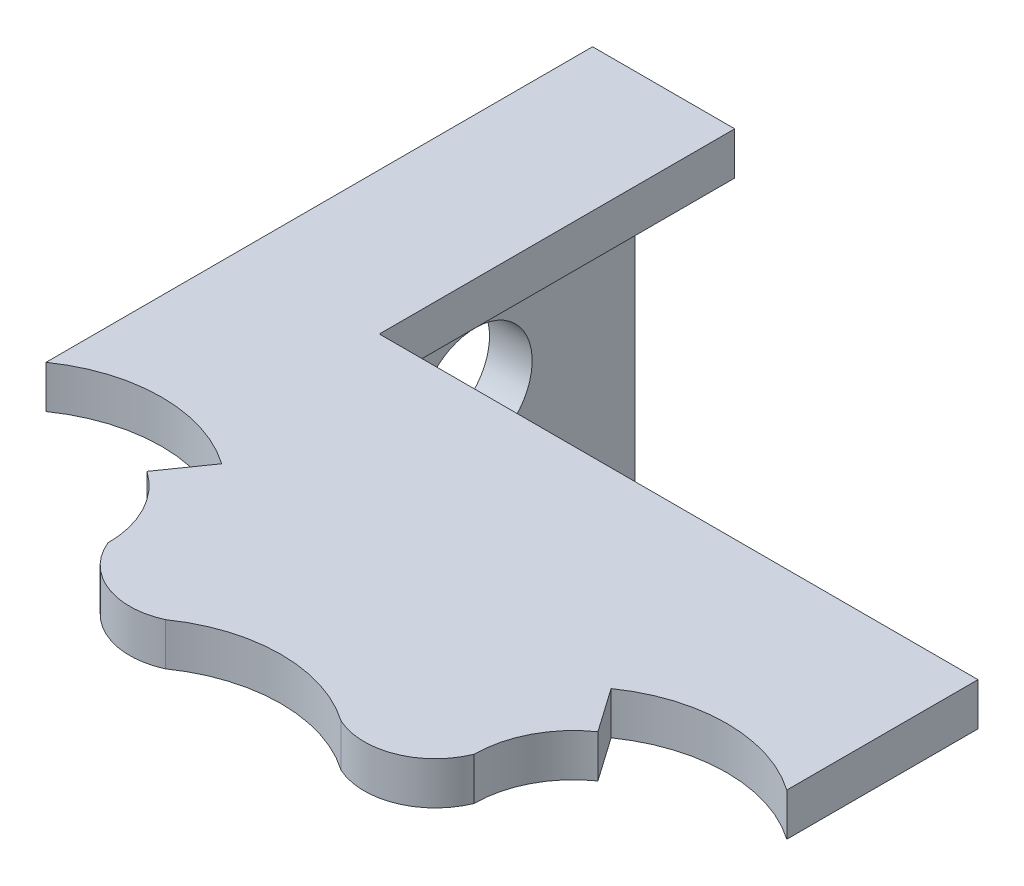
ISO-10303-21;
HEADER;
FILE_DESCRIPTION(('STEP AP214'),'2;1');
FILE_NAME('part.step','',(''),(''),'','','');
FILE_SCHEMA(('AUTOMOTIVE_DESIGN { 1 0 10303 214 1 1 1 1 }'));
ENDSEC;
DATA;
#1=APPLICATION_CONTEXT('core data for automotive mechanical design processes');
#2=APPLICATION_PROTOCOL_DEFINITION('international standard','automotive_design',2000,#1);
#3=PRODUCT_CONTEXT('',#1,'mechanical');
#4=PRODUCT('Part','Part','',(#3));
#5=PRODUCT_RELATED_PRODUCT_CATEGORY('part','',(#4));
#6=PRODUCT_DEFINITION_FORMATION('','',#4);
#7=PRODUCT_DEFINITION_CONTEXT('part definition',#1,'design');
#8=PRODUCT_DEFINITION('design','',#6,#7);
#9=PRODUCT_DEFINITION_SHAPE('','',#8);
#10=(LENGTH_UNIT() NAMED_UNIT(*) SI_UNIT(.MILLI.,.METRE.));
#11=(NAMED_UNIT(*) PLANE_ANGLE_UNIT() SI_UNIT($,.RADIAN.));
#12=(NAMED_UNIT(*) SI_UNIT($,.STERADIAN.) SOLID_ANGLE_UNIT());
#13=UNCERTAINTY_MEASURE_WITH_UNIT(LENGTH_MEASURE(1.E-05),#10,'distance_accuracy_value','');
#14=(GEOMETRIC_REPRESENTATION_CONTEXT(3) GLOBAL_UNCERTAINTY_ASSIGNED_CONTEXT((#13)) GLOBAL_UNIT_ASSIGNED_CONTEXT((#10,
#11,#12)) REPRESENTATION_CONTEXT('',''));
#15=CARTESIAN_POINT('',(0.,0.,0.));
#16=DIRECTION('',(0.,0.,1.));
#17=DIRECTION('',(1.,0.,0.));
#18=AXIS2_PLACEMENT_3D('',#15,#16,#17);
#19=CARTESIAN_POINT('',(-19.8752830168529,3.,-11.4749999999999));
#20=DIRECTION('',(0.,-1.,0.));
#21=DIRECTION('',(0.,0.,-1.));
#22=AXIS2_PLACEMENT_3D('',#19,#20,#21);
#23=CYLINDRICAL_SURFACE('',#22,10.775);
#24=CARTESIAN_POINT('',(-19.8752830168529,0.,-11.4749999999999));
#25=DIRECTION('',(0.,-1.,0.));
#26=DIRECTION('',(0.,0.,-1.));
#27=AXIS2_PLACEMENT_3D('',#24,#25,#26);
#28=CIRCLE('',#27,10.775);
#29=CARTESIAN_POINT('',(-26.0555691185354,0.,-20.3013632772138));
#30=VERTEX_POINT('',#29);
#31=CARTESIAN_POINT('',(-13.6949969151704,0.,-20.3013632772138));
#32=VERTEX_POINT('',#31);
#33=EDGE_CURVE('E181',#30,#32,#28,.T.);
#34=ORIENTED_EDGE('',*,*,#33,.T.);
#35=DIRECTION('',(0.,-1.,0.));
#36=VECTOR('',#35,1.);
#37=CARTESIAN_POINT('',(-13.6949969151704,3.,-20.3013632772138));
#38=LINE('',#37,#36);
#39=CARTESIAN_POINT('',(-13.6949969151704,3.,-20.3013632772138));
#40=VERTEX_POINT('',#39);
#41=EDGE_CURVE('E11',#40,#32,#38,.T.);
#42=ORIENTED_EDGE('',*,*,#41,.F.);
#43=CARTESIAN_POINT('',(-19.8752830168529,3.,-11.4749999999999));
#44=DIRECTION('',(0.,-1.,0.));
#45=DIRECTION('',(0.,0.,-1.));
#46=AXIS2_PLACEMENT_3D('',#43,#44,#45);
#47=CIRCLE('',#46,10.775);
#48=CARTESIAN_POINT('',(-26.0555691185354,3.,-20.3013632772138));
#49=VERTEX_POINT('',#48);
#50=EDGE_CURVE('E190',#49,#40,#47,.T.);
#51=ORIENTED_EDGE('',*,*,#50,.F.);
#52=DIRECTION('',(0.,-1.,0.));
#53=VECTOR('',#52,1.);
#54=CARTESIAN_POINT('',(-26.0555691185354,3.,-20.3013632772138));
#55=LINE('',#54,#53);
#56=EDGE_CURVE('E218',#49,#30,#55,.T.);
#57=ORIENTED_EDGE('',*,*,#56,.T.);
#58=EDGE_LOOP('',(#34,#42,#51,#57));
#59=FACE_BOUND('',#58,.T.);
#60=ADVANCED_FACE('F39',(#59),#23,.F.);
#61=CARTESIAN_POINT('',(-15.8602479623956,3.,-17.2090643100228));
#62=DIRECTION('',(0.819152044288993,0.,0.573576436351044));
#63=DIRECTION('',(0.573576436351044,0.,-0.819152044288993));
#64=AXIS2_PLACEMENT_3D('',#61,#62,#63);
#65=PLANE('',#64);
#66=DIRECTION('',(-0.573576436351044,0.,0.819152044288993));
#67=VECTOR('',#66,1.);
#68=CARTESIAN_POINT('',(-15.8602479623956,0.,-17.2090643100228));
#69=LINE('',#68,#67);
#70=CARTESIAN_POINT('',(-15.8602479623956,0.,-17.2090643100228));
#71=VERTEX_POINT('',#70);
#72=EDGE_CURVE('E184',#32,#71,#69,.T.);
#73=ORIENTED_EDGE('',*,*,#72,.T.);
#74=DIRECTION('',(0.,-1.,0.));
#75=VECTOR('',#74,1.);
#76=CARTESIAN_POINT('',(-15.8602479623956,3.,-17.2090643100228));
#77=LINE('',#76,#75);
#78=CARTESIAN_POINT('',(-15.8602479623956,3.,-17.2090643100228));
#79=VERTEX_POINT('',#78);
#80=EDGE_CURVE('E46',#79,#71,#77,.T.);
#81=ORIENTED_EDGE('',*,*,#80,.F.);
#82=DIRECTION('',(-0.573576436351044,0.,0.819152044288993));
#83=VECTOR('',#82,1.);
#84=CARTESIAN_POINT('',(-15.8602479623956,3.,-17.2090643100228));
#85=LINE('',#84,#83);
#86=EDGE_CURVE('E193',#40,#79,#85,.T.);
#87=ORIENTED_EDGE('',*,*,#86,.F.);
#88=ORIENTED_EDGE('',*,*,#41,.T.);
#89=EDGE_LOOP('',(#73,#81,#87,#88));
#90=FACE_BOUND('',#89,.T.);
#91=ADVANCED_FACE('F301',(#90),#65,.F.);
#92=CARTESIAN_POINT('',(-19.875283016853,3.,-11.4749999999998));
#93=DIRECTION('',(0.,-1.,0.));
#94=DIRECTION('',(0.,0.,-1.));
#95=AXIS2_PLACEMENT_3D('',#92,#93,#94);
#96=CYLINDRICAL_SURFACE('',#95,7.00000000000008);
#97=CARTESIAN_POINT('',(-19.875283016853,0.,-11.4749999999998));
#98=DIRECTION('',(0.,-1.,0.));
#99=DIRECTION('',(0.,0.,-1.));
#100=AXIS2_PLACEMENT_3D('',#97,#98,#99);
#101=CIRCLE('',#100,7.00000000000008);
#102=CARTESIAN_POINT('',(-12.8752830168529,0.,-11.4749999999999));
#103=VERTEX_POINT('',#102);
#104=EDGE_CURVE('E221',#71,#103,#101,.T.);
#105=ORIENTED_EDGE('',*,*,#104,.T.);
#106=DIRECTION('',(0.,-1.,0.));
#107=VECTOR('',#106,1.);
#108=CARTESIAN_POINT('',(-12.8752830168529,3.,-11.4749999999999));
#109=LINE('',#108,#107);
#110=CARTESIAN_POINT('',(-12.8752830168529,3.,-11.4749999999999));
#111=VERTEX_POINT('',#110);
#112=EDGE_CURVE('E273',#111,#103,#109,.T.);
#113=ORIENTED_EDGE('',*,*,#112,.F.);
#114=CARTESIAN_POINT('',(-19.875283016853,3.,-11.4749999999998));
#115=DIRECTION('',(0.,-1.,0.));
#116=DIRECTION('',(0.,0.,-1.));
#117=AXIS2_PLACEMENT_3D('',#114,#115,#116);
#118=CIRCLE('',#117,7.00000000000008);
#119=EDGE_CURVE('E195',#79,#111,#118,.T.);
#120=ORIENTED_EDGE('',*,*,#119,.F.);
#121=ORIENTED_EDGE('',*,*,#80,.T.);
#122=EDGE_LOOP('',(#105,#113,#120,#121));
#123=FACE_BOUND('',#122,.T.);
#124=ADVANCED_FACE('F280',(#123),#96,.F.);
#125=CARTESIAN_POINT('',(-8.25129203559566,3.,-13.3772900423571));
#126=DIRECTION('',(0.,-1.,0.));
#127=DIRECTION('',(0.,0.,-1.));
#128=AXIS2_PLACEMENT_3D('',#125,#126,#127);
#129=CYLINDRICAL_SURFACE('',#128,5.);
#130=CARTESIAN_POINT('',(-8.25129203559566,0.,-13.3772900423571));
#131=DIRECTION('',(0.,1.,0.));
#132=DIRECTION('',(0.,0.,1.));
#133=AXIS2_PLACEMENT_3D('',#130,#131,#132);
#134=CIRCLE('',#133,5.);
#135=CARTESIAN_POINT('',(-6.18028610168251,0.,-8.82636327721389));
#136=VERTEX_POINT('',#135);
#137=EDGE_CURVE('E223',#103,#136,#134,.T.);
#138=ORIENTED_EDGE('',*,*,#137,.T.);
#139=DIRECTION('',(0.,-1.,0.));
#140=VECTOR('',#139,1.);
#141=CARTESIAN_POINT('',(-6.18028610168251,3.,-8.82636327721389));
#142=LINE('',#141,#140);
#143=CARTESIAN_POINT('',(-6.18028610168251,3.,-8.82636327721389));
#144=VERTEX_POINT('',#143);
#145=EDGE_CURVE('E270',#144,#136,#142,.T.);
#146=ORIENTED_EDGE('',*,*,#145,.F.);
#147=CARTESIAN_POINT('',(-8.25129203559566,3.,-13.3772900423571));
#148=DIRECTION('',(0.,1.,0.));
#149=DIRECTION('',(0.,0.,1.));
#150=AXIS2_PLACEMENT_3D('',#147,#148,#149);
#151=CIRCLE('',#150,5.);
#152=EDGE_CURVE('E197',#111,#144,#151,.T.);
#153=ORIENTED_EDGE('',*,*,#152,.F.);
#154=ORIENTED_EDGE('',*,*,#112,.T.);
#155=EDGE_LOOP('',(#138,#146,#153,#154));
#156=FACE_BOUND('',#155,.T.);
#157=ADVANCED_FACE('F289',(#156),#129,.T.);
#158=CARTESIAN_POINT('',(0.,3.,0.));
#159=DIRECTION('',(0.,-1.,0.));
#160=DIRECTION('',(0.,0.,-1.));
#161=AXIS2_PLACEMENT_3D('',#158,#159,#160);
#162=CYLINDRICAL_SURFACE('',#161,10.775);
#163=CARTESIAN_POINT('',(0.,0.,0.));
#164=DIRECTION('',(0.,-1.,0.));
#165=DIRECTION('',(0.,0.,-1.));
#166=AXIS2_PLACEMENT_3D('',#163,#164,#165);
#167=CIRCLE('',#166,10.775);
#168=CARTESIAN_POINT('',(6.18028610168249,0.,-8.8263632772139));
#169=VERTEX_POINT('',#168);
#170=EDGE_CURVE('E225',#136,#169,#167,.T.);
#171=ORIENTED_EDGE('',*,*,#170,.T.);
#172=DIRECTION('',(0.,-1.,0.));
#173=VECTOR('',#172,1.);
#174=CARTESIAN_POINT('',(6.18028610168249,3.,-8.8263632772139));
#175=LINE('',#174,#173);
#176=CARTESIAN_POINT('',(6.18028610168249,3.,-8.8263632772139));
#177=VERTEX_POINT('',#176);
#178=EDGE_CURVE('E267',#177,#169,#175,.T.);
#179=ORIENTED_EDGE('',*,*,#178,.F.);
#180=CARTESIAN_POINT('',(0.,3.,0.));
#181=DIRECTION('',(0.,-1.,0.));
#182=DIRECTION('',(0.,0.,-1.));
#183=AXIS2_PLACEMENT_3D('',#180,#181,#182);
#184=CIRCLE('',#183,10.775);
#185=EDGE_CURVE('E199',#144,#177,#184,.T.);
#186=ORIENTED_EDGE('',*,*,#185,.F.);
#187=ORIENTED_EDGE('',*,*,#145,.T.);
#188=EDGE_LOOP('',(#171,#179,#186,#187));
#189=FACE_BOUND('',#188,.T.);
#190=ADVANCED_FACE('F293',(#189),#162,.F.);
#191=CARTESIAN_POINT('',(8.25129203559566,3.,-13.3772900423571));
#192=DIRECTION('',(0.,-1.,0.));
#193=DIRECTION('',(0.,0.,-1.));
#194=AXIS2_PLACEMENT_3D('',#191,#192,#193);
#195=CYLINDRICAL_SURFACE('',#194,5.00000000000001);
#196=CARTESIAN_POINT('',(8.25129203559566,0.,-13.3772900423571));
#197=DIRECTION('',(0.,1.,0.));
#198=DIRECTION('',(0.,0.,1.));
#199=AXIS2_PLACEMENT_3D('',#196,#197,#198);
#200=CIRCLE('',#199,5.00000000000001);
#201=CARTESIAN_POINT('',(12.8752830168529,0.,-11.4749999999998));
#202=VERTEX_POINT('',#201);
#203=EDGE_CURVE('E227',#169,#202,#200,.T.);
#204=ORIENTED_EDGE('',*,*,#203,.T.);
#205=DIRECTION('',(0.,-1.,0.));
#206=VECTOR('',#205,1.);
#207=CARTESIAN_POINT('',(12.8752830168529,3.,-11.4749999999998));
#208=LINE('',#207,#206);
#209=CARTESIAN_POINT('',(12.8752830168529,3.,-11.4749999999998));
#210=VERTEX_POINT('',#209);
#211=EDGE_CURVE('E264',#210,#202,#208,.T.);
#212=ORIENTED_EDGE('',*,*,#211,.F.);
#213=CARTESIAN_POINT('',(8.25129203559566,3.,-13.3772900423571));
#214=DIRECTION('',(0.,1.,0.));
#215=DIRECTION('',(0.,0.,1.));
#216=AXIS2_PLACEMENT_3D('',#213,#214,#215);
#217=CIRCLE('',#216,5.00000000000001);
#218=EDGE_CURVE('E201',#177,#210,#217,.T.);
#219=ORIENTED_EDGE('',*,*,#218,.F.);
#220=ORIENTED_EDGE('',*,*,#178,.T.);
#221=EDGE_LOOP('',(#204,#212,#219,#220));
#222=FACE_BOUND('',#221,.T.);
#223=ADVANCED_FACE('F349',(#222),#195,.T.);
#224=CARTESIAN_POINT('',(19.875283016853,3.,-11.4749999999998));
#225=DIRECTION('',(0.,-1.,0.));
#226=DIRECTION('',(0.,0.,-1.));
#227=AXIS2_PLACEMENT_3D('',#224,#225,#226);
#228=CYLINDRICAL_SURFACE('',#227,7.0000000000001);
#229=CARTESIAN_POINT('',(19.875283016853,0.,-11.4749999999998));
#230=DIRECTION('',(0.,-1.,0.));
#231=DIRECTION('',(0.,0.,-1.));
#232=AXIS2_PLACEMENT_3D('',#229,#230,#231);
#233=CIRCLE('',#232,7.0000000000001);
#234=CARTESIAN_POINT('',(15.8602479623956,0.,-17.2090643100228));
#235=VERTEX_POINT('',#234);
#236=EDGE_CURVE('E229',#202,#235,#233,.T.);
#237=ORIENTED_EDGE('',*,*,#236,.T.);
#238=DIRECTION('',(0.,-1.,0.));
#239=VECTOR('',#238,1.);
#240=CARTESIAN_POINT('',(15.8602479623956,3.,-17.2090643100228));
#241=LINE('',#240,#239);
#242=CARTESIAN_POINT('',(15.8602479623956,3.,-17.2090643100228));
#243=VERTEX_POINT('',#242);
#244=EDGE_CURVE('E261',#243,#235,#241,.T.);
#245=ORIENTED_EDGE('',*,*,#244,.F.);
#246=CARTESIAN_POINT('',(19.875283016853,3.,-11.4749999999998));
#247=DIRECTION('',(0.,-1.,0.));
#248=DIRECTION('',(0.,0.,-1.));
#249=AXIS2_PLACEMENT_3D('',#246,#247,#248);
#250=CIRCLE('',#249,7.0000000000001);
#251=EDGE_CURVE('E203',#210,#243,#250,.T.);
#252=ORIENTED_EDGE('',*,*,#251,.F.);
#253=ORIENTED_EDGE('',*,*,#211,.T.);
#254=EDGE_LOOP('',(#237,#245,#252,#253));
#255=FACE_BOUND('',#254,.T.);
#256=ADVANCED_FACE('F352',(#255),#228,.F.);
#257=CARTESIAN_POINT('',(15.8602479623956,3.,-17.2090643100228));
#258=DIRECTION('',(-0.819152044288992,0.,0.573576436351045));
#259=DIRECTION('',(0.573576436351045,0.,0.819152044288992));
#260=AXIS2_PLACEMENT_3D('',#257,#258,#259);
#261=PLANE('',#260);
#262=DIRECTION('',(-0.573576436351045,0.,-0.819152044288992));
#263=VECTOR('',#262,1.);
#264=CARTESIAN_POINT('',(15.8602479623956,0.,-17.2090643100228));
#265=LINE('',#264,#263);
#266=CARTESIAN_POINT('',(13.6949969151704,0.,-20.3013632772138));
#267=VERTEX_POINT('',#266);
#268=EDGE_CURVE('E231',#235,#267,#265,.T.);
#269=ORIENTED_EDGE('',*,*,#268,.T.);
#270=DIRECTION('',(0.,-1.,0.));
#271=VECTOR('',#270,1.);
#272=CARTESIAN_POINT('',(13.6949969151704,3.,-20.3013632772138));
#273=LINE('',#272,#271);
#274=CARTESIAN_POINT('',(13.6949969151704,3.,-20.3013632772138));
#275=VERTEX_POINT('',#274);
#276=EDGE_CURVE('E258',#275,#267,#273,.T.);
#277=ORIENTED_EDGE('',*,*,#276,.F.);
#278=DIRECTION('',(-0.573576436351045,0.,-0.819152044288992));
#279=VECTOR('',#278,1.);
#280=CARTESIAN_POINT('',(15.8602479623956,3.,-17.2090643100228));
#281=LINE('',#280,#279);
#282=EDGE_CURVE('E205',#243,#275,#281,.T.);
#283=ORIENTED_EDGE('',*,*,#282,.F.);
#284=ORIENTED_EDGE('',*,*,#244,.T.);
#285=EDGE_LOOP('',(#269,#277,#283,#284));
#286=FACE_BOUND('',#285,.T.);
#287=ADVANCED_FACE('F356',(#286),#261,.F.);
#288=CARTESIAN_POINT('',(19.8752830168529,3.,-11.4749999999998));
#289=DIRECTION('',(0.,-1.,0.));
#290=DIRECTION('',(0.,0.,-1.));
#291=AXIS2_PLACEMENT_3D('',#288,#289,#290);
#292=CYLINDRICAL_SURFACE('',#291,10.775);
#293=CARTESIAN_POINT('',(19.8752830168529,0.,-11.4749999999998));
#294=DIRECTION('',(0.,-1.,0.));
#295=DIRECTION('',(0.,0.,-1.));
#296=AXIS2_PLACEMENT_3D('',#293,#294,#295);
#297=CIRCLE('',#296,10.775);
#298=CARTESIAN_POINT('',(26.0555691185354,0.,-20.3013632772138));
#299=VERTEX_POINT('',#298);
#300=EDGE_CURVE('E233',#267,#299,#297,.T.);
#301=ORIENTED_EDGE('',*,*,#300,.T.);
#302=DIRECTION('',(0.,-1.,0.));
#303=VECTOR('',#302,1.);
#304=CARTESIAN_POINT('',(26.0555691185354,3.,-20.3013632772138));
#305=LINE('',#304,#303);
#306=CARTESIAN_POINT('',(26.0555691185354,3.,-20.3013632772138));
#307=VERTEX_POINT('',#306);
#308=EDGE_CURVE('E255',#307,#299,#305,.T.);
#309=ORIENTED_EDGE('',*,*,#308,.F.);
#310=CARTESIAN_POINT('',(19.8752830168529,3.,-11.4749999999998));
#311=DIRECTION('',(0.,-1.,0.));
#312=DIRECTION('',(0.,0.,-1.));
#313=AXIS2_PLACEMENT_3D('',#310,#311,#312);
#314=CIRCLE('',#313,10.775);
#315=EDGE_CURVE('E207',#275,#307,#314,.T.);
#316=ORIENTED_EDGE('',*,*,#315,.F.);
#317=ORIENTED_EDGE('',*,*,#276,.T.);
#318=EDGE_LOOP('',(#301,#309,#316,#317));
#319=FACE_BOUND('',#318,.T.);
#320=ADVANCED_FACE('F360',(#319),#292,.F.);
#321=CARTESIAN_POINT('',(26.0555691185354,3.,-33.7499999999999));
#322=DIRECTION('',(-1.,0.,0.));
#323=DIRECTION('',(0.,0.,1.));
#324=AXIS2_PLACEMENT_3D('',#321,#322,#323);
#325=PLANE('',#324);
#326=DIRECTION('',(0.,0.,-1.));
#327=VECTOR('',#326,1.);
#328=CARTESIAN_POINT('',(26.0555691185354,0.,-33.7499999999999));
#329=LINE('',#328,#327);
#330=CARTESIAN_POINT('',(26.0555691185354,0.,-33.7499999999999));
#331=VERTEX_POINT('',#330);
#332=EDGE_CURVE('E235',#299,#331,#329,.T.);
#333=ORIENTED_EDGE('',*,*,#332,.T.);
#334=DIRECTION('',(0.,-1.,0.));
#335=VECTOR('',#334,1.);
#336=CARTESIAN_POINT('',(26.0555691185354,3.,-33.7499999999999));
#337=LINE('',#336,#335);
#338=CARTESIAN_POINT('',(26.0555691185354,3.,-33.7499999999999));
#339=VERTEX_POINT('',#338);
#340=EDGE_CURVE('E252',#339,#331,#337,.T.);
#341=ORIENTED_EDGE('',*,*,#340,.F.);
#342=DIRECTION('',(0.,0.,-1.));
#343=VECTOR('',#342,1.);
#344=CARTESIAN_POINT('',(26.0555691185354,3.,-33.7499999999999));
#345=LINE('',#344,#343);
#346=EDGE_CURVE('E209',#307,#339,#345,.T.);
#347=ORIENTED_EDGE('',*,*,#346,.F.);
#348=ORIENTED_EDGE('',*,*,#308,.T.);
#349=EDGE_LOOP('',(#333,#341,#347,#348));
#350=FACE_BOUND('',#349,.T.);
#351=ADVANCED_FACE('F364',(#350),#325,.F.);
#352=CARTESIAN_POINT('',(-16.0555691185354,3.,-33.7499999999999));
#353=DIRECTION('',(0.,0.,1.));
#354=DIRECTION('',(1.,0.,0.));
#355=AXIS2_PLACEMENT_3D('',#352,#353,#354);
#356=PLANE('',#355);
#357=DIRECTION('',(-1.,0.,0.));
#358=VECTOR('',#357,1.);
#359=CARTESIAN_POINT('',(-16.0555691185354,0.,-33.7499999999999));
#360=LINE('',#359,#358);
#361=CARTESIAN_POINT('',(-16.0555691185354,0.,-33.7499999999999));
#362=VERTEX_POINT('',#361);
#363=EDGE_CURVE('E237',#331,#362,#360,.T.);
#364=ORIENTED_EDGE('',*,*,#363,.T.);
#365=DIRECTION('',(0.,-1.,0.));
#366=VECTOR('',#365,1.);
#367=CARTESIAN_POINT('',(-16.0555691185354,3.,-33.7499999999999));
#368=LINE('',#367,#366);
#369=CARTESIAN_POINT('',(-16.0555691185354,3.,-33.7499999999999));
#370=VERTEX_POINT('',#369);
#371=EDGE_CURVE('E249',#370,#362,#368,.T.);
#372=ORIENTED_EDGE('',*,*,#371,.F.);
#373=DIRECTION('',(-1.,0.,0.));
#374=VECTOR('',#373,1.);
#375=CARTESIAN_POINT('',(-16.0555691185354,3.,-33.7499999999999));
#376=LINE('',#375,#374);
#377=EDGE_CURVE('E211',#339,#370,#376,.T.);
#378=ORIENTED_EDGE('',*,*,#377,.F.);
#379=ORIENTED_EDGE('',*,*,#340,.T.);
#380=EDGE_LOOP('',(#364,#372,#378,#379));
#381=FACE_BOUND('',#380,.T.);
#382=ADVANCED_FACE('F368',(#381),#356,.F.);
#383=CARTESIAN_POINT('',(-16.0555691185354,3.,-58.7499999999999));
#384=DIRECTION('',(-1.,0.,0.));
#385=DIRECTION('',(0.,0.,1.));
#386=AXIS2_PLACEMENT_3D('',#383,#384,#385);
#387=PLANE('',#386);
#388=DIRECTION('',(0.,0.,-1.));
#389=VECTOR('',#388,1.);
#390=CARTESIAN_POINT('',(-16.0555691185354,0.,-58.7499999999999));
#391=LINE('',#390,#389);
#392=CARTESIAN_POINT('',(-16.0555691185354,0.,-58.7499999999999));
#393=VERTEX_POINT('',#392);
#394=EDGE_CURVE('E239',#362,#393,#391,.T.);
#395=ORIENTED_EDGE('',*,*,#394,.T.);
#396=DIRECTION('',(0.,-1.,0.));
#397=VECTOR('',#396,1.);
#398=CARTESIAN_POINT('',(-16.0555691185354,3.,-58.7499999999999));
#399=LINE('',#398,#397);
#400=CARTESIAN_POINT('',(-16.0555691185354,3.,-58.7499999999999));
#401=VERTEX_POINT('',#400);
#402=EDGE_CURVE('E247',#401,#393,#399,.T.);
#403=ORIENTED_EDGE('',*,*,#402,.F.);
#404=DIRECTION('',(0.,0.,-1.));
#405=VECTOR('',#404,1.);
#406=CARTESIAN_POINT('',(-16.0555691185354,3.,-58.7499999999999));
#407=LINE('',#406,#405);
#408=EDGE_CURVE('E213',#370,#401,#407,.T.);
#409=ORIENTED_EDGE('',*,*,#408,.F.);
#410=ORIENTED_EDGE('',*,*,#371,.T.);
#411=EDGE_LOOP('',(#395,#403,#409,#410));
#412=FACE_BOUND('',#411,.T.);
#413=ADVANCED_FACE('F333',(#412),#387,.F.);
#414=CARTESIAN_POINT('',(-26.0555691185354,3.,-58.7499999999999));
#415=DIRECTION('',(0.,0.,1.));
#416=DIRECTION('',(1.,0.,0.));
#417=AXIS2_PLACEMENT_3D('',#414,#415,#416);
#418=PLANE('',#417);
#419=DIRECTION('',(-1.,0.,0.));
#420=VECTOR('',#419,1.);
#421=CARTESIAN_POINT('',(-26.0555691185354,0.,-58.7499999999999));
#422=LINE('',#421,#420);
#423=CARTESIAN_POINT('',(-23.0555691185354,0.,-58.7499999999999));
#424=VERTEX_POINT('',#423);
#425=EDGE_CURVE('E180',#393,#424,#422,.T.);
#426=ORIENTED_EDGE('',*,*,#425,.T.);
#427=DIRECTION('',(0.,1.,0.));
#428=VECTOR('',#427,1.);
#429=CARTESIAN_POINT('',(-23.0555691185354,-25.,-58.7499999999999));
#430=LINE('',#429,#428);
#431=CARTESIAN_POINT('',(-23.0555691185354,-25.,-58.7499999999999));
#432=VERTEX_POINT('',#431);
#433=EDGE_CURVE('E161',#432,#424,#430,.T.);
#434=ORIENTED_EDGE('',*,*,#433,.F.);
#435=DIRECTION('',(1.,0.,0.));
#436=VECTOR('',#435,1.);
#437=CARTESIAN_POINT('',(-26.0555691185354,-25.,-58.7499999999999));
#438=LINE('',#437,#436);
#439=CARTESIAN_POINT('',(-26.0555691185354,-25.,-58.7499999999999));
#440=VERTEX_POINT('',#439);
#441=EDGE_CURVE('E167',#440,#432,#438,.T.);
#442=ORIENTED_EDGE('',*,*,#441,.F.);
#443=DIRECTION('',(0.,-1.,0.));
#444=VECTOR('',#443,1.);
#445=CARTESIAN_POINT('',(-26.0555691185354,3.,-58.7499999999999));
#446=LINE('',#445,#444);
#447=CARTESIAN_POINT('',(-26.0555691185354,3.,-58.7499999999999));
#448=VERTEX_POINT('',#447);
#449=EDGE_CURVE('E245',#448,#440,#446,.T.);
#450=ORIENTED_EDGE('',*,*,#449,.F.);
#451=DIRECTION('',(-1.,0.,0.));
#452=VECTOR('',#451,1.);
#453=CARTESIAN_POINT('',(-26.0555691185354,3.,-58.7499999999999));
#454=LINE('',#453,#452);
#455=EDGE_CURVE('E215',#401,#448,#454,.T.);
#456=ORIENTED_EDGE('',*,*,#455,.F.);
#457=ORIENTED_EDGE('',*,*,#402,.T.);
#458=EDGE_LOOP('',(#426,#434,#442,#450,#456,#457));
#459=FACE_BOUND('',#458,.T.);
#460=ADVANCED_FACE('F178',(#459),#418,.F.);
#461=CARTESIAN_POINT('',(-26.0555691185354,3.,-20.3013632772138));
#462=DIRECTION('',(1.,0.,0.));
#463=DIRECTION('',(0.,0.,-1.));
#464=AXIS2_PLACEMENT_3D('',#461,#462,#463);
#465=PLANE('',#464);
#466=CARTESIAN_POINT('',(-26.0555691185355,-11.,-47.4999999999999));
#467=DIRECTION('',(-1.,0.,0.));
#468=DIRECTION('',(0.,0.,1.));
#469=AXIS2_PLACEMENT_3D('',#466,#467,#468);
#470=CIRCLE('',#469,4.);
#471=CARTESIAN_POINT('',(-26.0555691185355,-11.,-43.4999999999999));
#472=VERTEX_POINT('',#471);
#473=EDGE_CURVE('E318',#472,#472,#470,.T.);
#474=ORIENTED_EDGE('',*,*,#473,.F.);
#475=EDGE_LOOP('',(#474));
#476=FACE_BOUND('',#475,.T.);
#477=ORIENTED_EDGE('',*,*,#449,.T.);
#478=DIRECTION('',(0.,0.,-1.));
#479=VECTOR('',#478,1.);
#480=CARTESIAN_POINT('',(-26.0555691185354,-25.,-58.7499999999999));
#481=LINE('',#480,#479);
#482=CARTESIAN_POINT('',(-26.0555691185354,-25.,-36.2499999999999));
#483=VERTEX_POINT('',#482);
#484=EDGE_CURVE('E173',#483,#440,#481,.T.);
#485=ORIENTED_EDGE('',*,*,#484,.F.);
#486=DIRECTION('',(0.,1.,0.));
#487=VECTOR('',#486,1.);
#488=CARTESIAN_POINT('',(-26.0555691185354,-25.,-36.2499999999999));
#489=LINE('',#488,#487);
#490=CARTESIAN_POINT('',(-26.0555691185354,0.,-36.2499999999999));
#491=VERTEX_POINT('',#490);
#492=EDGE_CURVE('E186',#483,#491,#489,.T.);
#493=ORIENTED_EDGE('',*,*,#492,.T.);
#494=DIRECTION('',(0.,0.,1.));
#495=VECTOR('',#494,1.);
#496=CARTESIAN_POINT('',(-26.0555691185354,0.,-20.3013632772138));
#497=LINE('',#496,#495);
#498=EDGE_CURVE('E59',#491,#30,#497,.T.);
#499=ORIENTED_EDGE('',*,*,#498,.T.);
#500=ORIENTED_EDGE('',*,*,#56,.F.);
#501=DIRECTION('',(0.,0.,1.));
#502=VECTOR('',#501,1.);
#503=CARTESIAN_POINT('',(-26.0555691185354,3.,-58.7499999999999));
#504=LINE('',#503,#502);
#505=EDGE_CURVE('E217',#448,#49,#504,.T.);
#506=ORIENTED_EDGE('',*,*,#505,.F.);
#507=EDGE_LOOP('',(#477,#485,#493,#499,#500,#506));
#508=FACE_BOUND('',#507,.T.);
#509=ADVANCED_FACE('F306',(#476,#508),#465,.F.);
#510=CARTESIAN_POINT('',(-19.8752830168529,3.,-11.4749999999999));
#511=DIRECTION('',(0.,-1.,0.));
#512=DIRECTION('',(0.,0.,-1.));
#513=AXIS2_PLACEMENT_3D('',#510,#511,#512);
#514=PLANE('',#513);
#515=ORIENTED_EDGE('',*,*,#50,.T.);
#516=ORIENTED_EDGE('',*,*,#86,.T.);
#517=ORIENTED_EDGE('',*,*,#119,.T.);
#518=ORIENTED_EDGE('',*,*,#152,.T.);
#519=ORIENTED_EDGE('',*,*,#185,.T.);
#520=ORIENTED_EDGE('',*,*,#218,.T.);
#521=ORIENTED_EDGE('',*,*,#251,.T.);
#522=ORIENTED_EDGE('',*,*,#282,.T.);
#523=ORIENTED_EDGE('',*,*,#315,.T.);
#524=ORIENTED_EDGE('',*,*,#346,.T.);
#525=ORIENTED_EDGE('',*,*,#377,.T.);
#526=ORIENTED_EDGE('',*,*,#408,.T.);
#527=ORIENTED_EDGE('',*,*,#455,.T.);
#528=ORIENTED_EDGE('',*,*,#505,.T.);
#529=EDGE_LOOP('',(#515,#516,#517,#518,#519,#520,#521,#522,#523,#524,#525,#526,#527,#528));
#530=FACE_BOUND('',#529,.T.);
#531=ADVANCED_FACE('F297',(#530),#514,.F.);
#532=CARTESIAN_POINT('',(-19.8752830168529,0.,-11.4749999999999));
#533=DIRECTION('',(0.,-1.,0.));
#534=DIRECTION('',(0.,0.,-1.));
#535=AXIS2_PLACEMENT_3D('',#532,#533,#534);
#536=PLANE('',#535);
#537=DIRECTION('',(-1.,0.,0.));
#538=VECTOR('',#537,1.);
#539=CARTESIAN_POINT('',(-26.0555691185354,0.,-36.2499999999999));
#540=LINE('',#539,#538);
#541=CARTESIAN_POINT('',(-23.0555691185354,0.,-36.2499999999999));
#542=VERTEX_POINT('',#541);
#543=EDGE_CURVE('E176',#542,#491,#540,.T.);
#544=ORIENTED_EDGE('',*,*,#543,.F.);
#545=DIRECTION('',(0.,0.,1.));
#546=VECTOR('',#545,1.);
#547=CARTESIAN_POINT('',(-23.0555691185354,0.,-58.7499999999999));
#548=LINE('',#547,#546);
#549=EDGE_CURVE('E53',#424,#542,#548,.T.);
#550=ORIENTED_EDGE('',*,*,#549,.F.);
#551=ORIENTED_EDGE('',*,*,#425,.F.);
#552=ORIENTED_EDGE('',*,*,#394,.F.);
#553=ORIENTED_EDGE('',*,*,#363,.F.);
#554=ORIENTED_EDGE('',*,*,#332,.F.);
#555=ORIENTED_EDGE('',*,*,#300,.F.);
#556=ORIENTED_EDGE('',*,*,#268,.F.);
#557=ORIENTED_EDGE('',*,*,#236,.F.);
#558=ORIENTED_EDGE('',*,*,#203,.F.);
#559=ORIENTED_EDGE('',*,*,#170,.F.);
#560=ORIENTED_EDGE('',*,*,#137,.F.);
#561=ORIENTED_EDGE('',*,*,#104,.F.);
#562=ORIENTED_EDGE('',*,*,#72,.F.);
#563=ORIENTED_EDGE('',*,*,#33,.F.);
#564=ORIENTED_EDGE('',*,*,#498,.F.);
#565=EDGE_LOOP('',(#544,#550,#551,#552,#553,#554,#555,#556,#557,#558,#559,#560,#561,#562,#563,#564));
#566=FACE_BOUND('',#565,.T.);
#567=ADVANCED_FACE('F284',(#566),#536,.T.);
#568=CARTESIAN_POINT('',(-23.0555691185354,-25.,-58.7499999999999));
#569=DIRECTION('',(-1.,0.,0.));
#570=DIRECTION('',(0.,0.,1.));
#571=AXIS2_PLACEMENT_3D('',#568,#569,#570);
#572=PLANE('',#571);
#573=CARTESIAN_POINT('',(-23.0555691185354,-11.,-47.4999999999999));
#574=DIRECTION('',(-1.,0.,0.));
#575=DIRECTION('',(0.,0.,1.));
#576=AXIS2_PLACEMENT_3D('',#573,#574,#575);
#577=CIRCLE('',#576,4.);
#578=CARTESIAN_POINT('',(-23.0555691185354,-11.,-43.4999999999999));
#579=VERTEX_POINT('',#578);
#580=EDGE_CURVE('E313',#579,#579,#577,.F.);
#581=ORIENTED_EDGE('',*,*,#580,.F.);
#582=EDGE_LOOP('',(#581));
#583=FACE_BOUND('',#582,.T.);
#584=ORIENTED_EDGE('',*,*,#549,.T.);
#585=DIRECTION('',(0.,1.,0.));
#586=VECTOR('',#585,1.);
#587=CARTESIAN_POINT('',(-23.0555691185354,-25.,-36.2499999999999));
#588=LINE('',#587,#586);
#589=CARTESIAN_POINT('',(-23.0555691185354,-25.,-36.2499999999999));
#590=VERTEX_POINT('',#589);
#591=EDGE_CURVE('E163',#590,#542,#588,.T.);
#592=ORIENTED_EDGE('',*,*,#591,.F.);
#593=DIRECTION('',(0.,0.,1.));
#594=VECTOR('',#593,1.);
#595=CARTESIAN_POINT('',(-23.0555691185354,-25.,-58.7499999999999));
#596=LINE('',#595,#594);
#597=EDGE_CURVE('E157',#432,#590,#596,.T.);
#598=ORIENTED_EDGE('',*,*,#597,.F.);
#599=ORIENTED_EDGE('',*,*,#433,.T.);
#600=EDGE_LOOP('',(#584,#592,#598,#599));
#601=FACE_BOUND('',#600,.T.);
#602=ADVANCED_FACE('F159',(#583,#601),#572,.F.);
#603=CARTESIAN_POINT('',(-26.0555691185354,-25.,-36.2499999999999));
#604=DIRECTION('',(0.,0.,-1.));
#605=DIRECTION('',(-1.,0.,0.));
#606=AXIS2_PLACEMENT_3D('',#603,#604,#605);
#607=PLANE('',#606);
#608=ORIENTED_EDGE('',*,*,#543,.T.);
#609=ORIENTED_EDGE('',*,*,#492,.F.);
#610=DIRECTION('',(-1.,0.,0.));
#611=VECTOR('',#610,1.);
#612=CARTESIAN_POINT('',(-26.0555691185354,-25.,-36.2499999999999));
#613=LINE('',#612,#611);
#614=EDGE_CURVE('E166',#590,#483,#613,.T.);
#615=ORIENTED_EDGE('',*,*,#614,.F.);
#616=ORIENTED_EDGE('',*,*,#591,.T.);
#617=EDGE_LOOP('',(#608,#609,#615,#616));
#618=FACE_BOUND('',#617,.T.);
#619=ADVANCED_FACE('F419',(#618),#607,.F.);
#620=CARTESIAN_POINT('',(0.,-25.,0.));
#621=DIRECTION('',(0.,-1.,0.));
#622=DIRECTION('',(0.,0.,-1.));
#623=AXIS2_PLACEMENT_3D('',#620,#621,#622);
#624=PLANE('',#623);
#625=ORIENTED_EDGE('',*,*,#441,.T.);
#626=ORIENTED_EDGE('',*,*,#597,.T.);
#627=ORIENTED_EDGE('',*,*,#614,.T.);
#628=ORIENTED_EDGE('',*,*,#484,.T.);
#629=EDGE_LOOP('',(#625,#626,#627,#628));
#630=FACE_BOUND('',#629,.T.);
#631=ADVANCED_FACE('F171',(#630),#624,.T.);
#632=CARTESIAN_POINT('',(-11.7418606195507,-11.,-47.4999999999999));
#633=DIRECTION('',(-1.,0.,0.));
#634=DIRECTION('',(0.,0.,1.));
#635=AXIS2_PLACEMENT_3D('',#632,#633,#634);
#636=CYLINDRICAL_SURFACE('',#635,4.);
#637=ORIENTED_EDGE('',*,*,#580,.T.);
#638=EDGE_LOOP('',(#637));
#639=FACE_BOUND('',#638,.T.);
#640=ORIENTED_EDGE('',*,*,#473,.T.);
#641=EDGE_LOOP('',(#640));
#642=FACE_BOUND('',#641,.T.);
#643=ADVANCED_FACE('F322',(#639,#642),#636,.F.);
#644=CLOSED_SHELL('',(#60,#91,#124,#157,#190,#223,#256,#287,#320,#351,#382,#413,#460,#509,#531,
#567,#602,#619,#631,#643));
#645=MANIFOLD_SOLID_BREP('B2',#644);
#646=ADVANCED_BREP_SHAPE_REPRESENTATION('',(#18,#645),#14);
#647=SHAPE_DEFINITION_REPRESENTATION(#9,#646);
ENDSEC;
END-ISO-10303-21;
